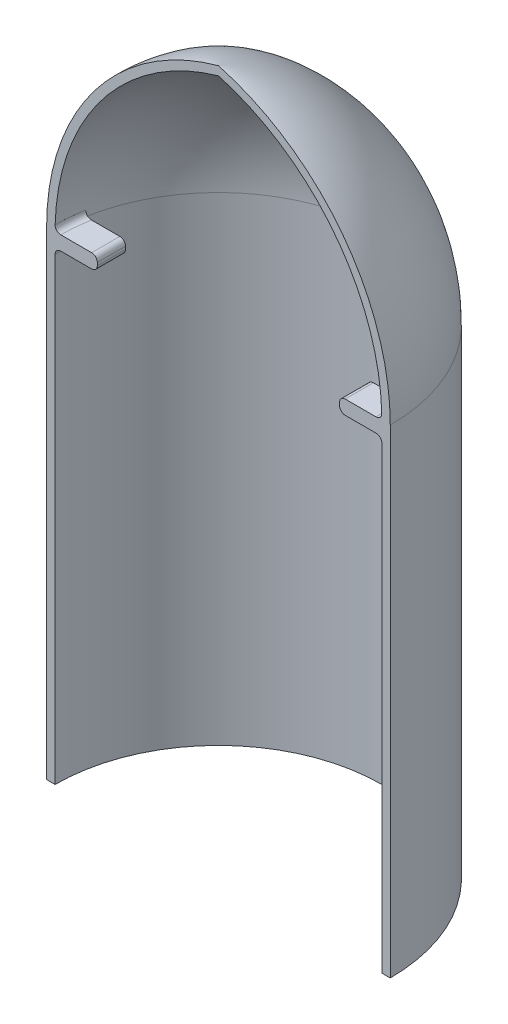
ISO-10303-21;
HEADER;
FILE_DESCRIPTION(('STEP AP214'),'2;1');
FILE_NAME('part.step','',(''),(''),'','','');
FILE_SCHEMA(('AUTOMOTIVE_DESIGN { 1 0 10303 214 1 1 1 1 }'));
ENDSEC;
DATA;
#1=APPLICATION_CONTEXT('core data for automotive mechanical design processes');
#2=APPLICATION_PROTOCOL_DEFINITION('international standard','automotive_design',2000,#1);
#3=PRODUCT_CONTEXT('',#1,'mechanical');
#4=PRODUCT('Part','Part','',(#3));
#5=PRODUCT_RELATED_PRODUCT_CATEGORY('part','',(#4));
#6=PRODUCT_DEFINITION_FORMATION('','',#4);
#7=PRODUCT_DEFINITION_CONTEXT('part definition',#1,'design');
#8=PRODUCT_DEFINITION('design','',#6,#7);
#9=PRODUCT_DEFINITION_SHAPE('','',#8);
#10=(LENGTH_UNIT() NAMED_UNIT(*) SI_UNIT(.MILLI.,.METRE.));
#11=(NAMED_UNIT(*) PLANE_ANGLE_UNIT() SI_UNIT($,.RADIAN.));
#12=(NAMED_UNIT(*) SI_UNIT($,.STERADIAN.) SOLID_ANGLE_UNIT());
#13=UNCERTAINTY_MEASURE_WITH_UNIT(LENGTH_MEASURE(1.E-05),#10,'distance_accuracy_value','');
#14=(GEOMETRIC_REPRESENTATION_CONTEXT(3) GLOBAL_UNCERTAINTY_ASSIGNED_CONTEXT((#13)) GLOBAL_UNIT_ASSIGNED_CONTEXT((#10,
#11,#12)) REPRESENTATION_CONTEXT('',''));
#15=CARTESIAN_POINT('',(0.,0.,0.));
#16=DIRECTION('',(0.,0.,1.));
#17=DIRECTION('',(1.,0.,0.));
#18=AXIS2_PLACEMENT_3D('',#15,#16,#17);
#19=CARTESIAN_POINT('',(0.,170.,21.9590163934426));
#20=DIRECTION('',(-1.,0.,0.));
#21=DIRECTION('',(0.,0.,-1.));
#22=AXIS2_PLACEMENT_3D('',#19,#20,#21);
#23=CIRCLE('',#22,82.9590163934426);
#24=TRIMMED_CURVE('',#23,(PARAMETER_VALUE(-1.30290645490157)),
(PARAMETER_VALUE(1.30290645490157)),.T.,.PARAMETER.);
#25=CARTESIAN_POINT('',(0.,170.,0.));
#26=DIRECTION('',(0.,-1.,0.));
#27=AXIS1_PLACEMENT('',#25,#26);
#28=SURFACE_OF_REVOLUTION('',#24,#27);
#29=CARTESIAN_POINT('',(-21.9590163934426,170.,0.));
#30=DIRECTION('',(0.,0.,1.));
#31=DIRECTION('',(1.,0.,0.));
#32=AXIS2_PLACEMENT_3D('',#29,#30,#31);
#33=CIRCLE('',#32,82.9590163934426);
#34=CARTESIAN_POINT('',(61.,170.,0.));
#35=VERTEX_POINT('',#34);
#36=CARTESIAN_POINT('',(0.,250.,0.));
#37=VERTEX_POINT('',#36);
#38=EDGE_CURVE('E484',#35,#37,#33,.T.);
#39=ORIENTED_EDGE('',*,*,#38,.F.);
#40=CARTESIAN_POINT('',(0.,170.,0.));
#41=DIRECTION('',(0.,-1.,0.));
#42=DIRECTION('',(0.,0.,-1.));
#43=AXIS2_PLACEMENT_3D('',#40,#41,#42);
#44=CIRCLE('',#43,61.);
#45=CARTESIAN_POINT('',(-61.,170.,4.25960723338862E-13));
#46=VERTEX_POINT('',#45);
#47=EDGE_CURVE('E216',#46,#35,#44,.T.);
#48=ORIENTED_EDGE('',*,*,#47,.F.);
#49=CARTESIAN_POINT('',(21.9590163934426,170.,-1.53338991914111E-13));
#50=DIRECTION('',(0.,0.,-1.));
#51=DIRECTION('',(-1.,0.,0.));
#52=AXIS2_PLACEMENT_3D('',#49,#50,#51);
#53=CIRCLE('',#52,82.9590163934426);
#54=EDGE_CURVE('E201',#46,#37,#53,.T.);
#55=ORIENTED_EDGE('',*,*,#54,.T.);
#56=EDGE_LOOP('',(#39,#48,#55));
#57=FACE_BOUND('',#56,.T.);
#58=ADVANCED_FACE('F33',(#57),#28,.T.);
#59=CARTESIAN_POINT('',(0.,170.,21.9590163934426));
#60=DIRECTION('',(-1.,0.,0.));
#61=DIRECTION('',(0.,0.,-1.));
#62=AXIS2_PLACEMENT_3D('',#59,#60,#61);
#63=CIRCLE('',#62,79.9590163934426);
#64=TRIMMED_CURVE('',#63,(PARAMETER_VALUE(-1.29259310940795)),
(PARAMETER_VALUE(1.29259310940795)),.T.,.PARAMETER.);
#65=CARTESIAN_POINT('',(0.,170.,0.));
#66=DIRECTION('',(0.,-1.,0.));
#67=AXIS1_PLACEMENT('',#65,#66);
#68=SURFACE_OF_REVOLUTION('',#64,#67);
#69=CARTESIAN_POINT('',(21.9590163934426,170.,-1.53338991914111E-13));
#70=DIRECTION('',(0.,0.,1.));
#71=DIRECTION('',(-1.,0.,0.));
#72=AXIS2_PLACEMENT_3D('',#69,#70,#71);
#73=CIRCLE('',#72,79.9590163934426);
#74=CARTESIAN_POINT('',(0.,246.884627212723,0.));
#75=VERTEX_POINT('',#74);
#76=CARTESIAN_POINT('',(-57.9736830101793,172.051309010619,4.04828064748096E-13));
#77=VERTEX_POINT('',#76);
#78=EDGE_CURVE('E207',#75,#77,#73,.T.);
#79=ORIENTED_EDGE('',*,*,#78,.T.);
#80=CARTESIAN_POINT('',(0.,172.051309010619,0.));
#81=DIRECTION('',(0.,-1.,0.));
#82=DIRECTION('',(0.,0.,-1.));
#83=AXIS2_PLACEMENT_3D('',#80,#81,#82);
#84=CIRCLE('',#83,57.9736830101793);
#85=CARTESIAN_POINT('',(-57.1047101539335,172.051309010619,-10.));
#86=VERTEX_POINT('',#85);
#87=EDGE_CURVE('E554',#77,#86,#84,.T.);
#88=ORIENTED_EDGE('',*,*,#87,.T.);
#89=CARTESIAN_POINT('',(-57.1047101539335,172.051309010619,-10.));
#90=CARTESIAN_POINT('',(-57.1136157296202,171.709482169664,-10.));
#91=CARTESIAN_POINT('',(-57.1202949569977,171.367626331634,-10.));
#92=CARTESIAN_POINT('',(-57.1292007151342,170.683856661428,-10.));
#93=CARTESIAN_POINT('',(-57.1314272458931,170.341942829251,-10.));
#94=CARTESIAN_POINT('',(-57.1314274283428,170.,-10.));
#95=B_SPLINE_CURVE_WITH_KNOTS('',3,(#89,#90,#91,#92,#93,#94),.UNSPECIFIED.,.F.,.F.,(4,2,4),(0.,
1.0257632449345,2.05152648986903),.UNSPECIFIED.);
#96=CARTESIAN_POINT('',(-57.1314274283428,170.,-10.));
#97=VERTEX_POINT('',#96);
#98=EDGE_CURVE('E237',#86,#97,#95,.T.);
#99=ORIENTED_EDGE('',*,*,#98,.T.);
#100=CARTESIAN_POINT('',(0.,170.,0.));
#101=DIRECTION('',(0.,-1.,0.));
#102=DIRECTION('',(0.,0.,-1.));
#103=AXIS2_PLACEMENT_3D('',#100,#101,#102);
#104=CIRCLE('',#103,58.);
#105=CARTESIAN_POINT('',(57.1314274283428,170.,-10.));
#106=VERTEX_POINT('',#105);
#107=EDGE_CURVE('E195',#97,#106,#104,.T.);
#108=ORIENTED_EDGE('',*,*,#107,.T.);
#109=CARTESIAN_POINT('',(57.1314274283428,170.,-10.));
#110=CARTESIAN_POINT('',(57.1314272458931,170.341942829251,-10.));
#111=CARTESIAN_POINT('',(57.1292007151342,170.683856661428,-10.));
#112=CARTESIAN_POINT('',(57.1202949569977,171.367626331634,-10.));
#113=CARTESIAN_POINT('',(57.1136157296202,171.709482169664,-10.));
#114=CARTESIAN_POINT('',(57.1047101539335,172.051309010619,-10.));
#115=B_SPLINE_CURVE_WITH_KNOTS('',3,(#109,#110,#111,#112,#113,#114),.UNSPECIFIED.,.F.,.F.,(4,2,
4),(0.,1.02576324493449,2.051526489869),.UNSPECIFIED.);
#116=CARTESIAN_POINT('',(57.1047101539335,172.051309010619,-10.));
#117=VERTEX_POINT('',#116);
#118=EDGE_CURVE('E229',#106,#117,#115,.T.);
#119=ORIENTED_EDGE('',*,*,#118,.T.);
#120=CARTESIAN_POINT('',(0.,172.051309010619,0.));
#121=DIRECTION('',(0.,-1.,0.));
#122=DIRECTION('',(0.,0.,-1.));
#123=AXIS2_PLACEMENT_3D('',#120,#121,#122);
#124=CIRCLE('',#123,57.9736830101793);
#125=CARTESIAN_POINT('',(57.9736830101793,172.051309010619,0.));
#126=VERTEX_POINT('',#125);
#127=EDGE_CURVE('E227',#117,#126,#124,.T.);
#128=ORIENTED_EDGE('',*,*,#127,.T.);
#129=CARTESIAN_POINT('',(-21.9590163934426,170.,0.));
#130=DIRECTION('',(0.,0.,-1.));
#131=DIRECTION('',(1.,0.,0.));
#132=AXIS2_PLACEMENT_3D('',#129,#130,#131);
#133=CIRCLE('',#132,79.9590163934426);
#134=EDGE_CURVE('E185',#75,#126,#133,.T.);
#135=ORIENTED_EDGE('',*,*,#134,.F.);
#136=EDGE_LOOP('',(#79,#88,#99,#108,#119,#128,#135));
#137=FACE_BOUND('',#136,.T.);
#138=ADVANCED_FACE('F243',(#137),#68,.F.);
#139=CARTESIAN_POINT('',(0.,0.,0.));
#140=DIRECTION('',(0.,-1.,0.));
#141=DIRECTION('',(0.,0.,-1.));
#142=AXIS2_PLACEMENT_3D('',#139,#140,#141);
#143=CYLINDRICAL_SURFACE('',#142,58.);
#144=DIRECTION('',(0.,-1.,0.));
#145=VECTOR('',#144,1.);
#146=CARTESIAN_POINT('',(-57.1314274283428,0.,-10.));
#147=LINE('',#146,#145);
#148=CARTESIAN_POINT('',(-57.1314274283428,163.,-10.));
#149=VERTEX_POINT('',#148);
#150=EDGE_CURVE('E224',#149,#97,#147,.F.);
#151=ORIENTED_EDGE('',*,*,#150,.F.);
#152=CARTESIAN_POINT('',(0.,163.,0.));
#153=DIRECTION('',(0.,-1.,0.));
#154=DIRECTION('',(0.,0.,-1.));
#155=AXIS2_PLACEMENT_3D('',#152,#153,#154);
#156=CIRCLE('',#155,58.);
#157=CARTESIAN_POINT('',(-58.,163.,4.05011835305803E-13));
#158=VERTEX_POINT('',#157);
#159=EDGE_CURVE('E299',#149,#158,#156,.F.);
#160=ORIENTED_EDGE('',*,*,#159,.T.);
#161=DIRECTION('',(0.,-1.,0.));
#162=VECTOR('',#161,1.);
#163=CARTESIAN_POINT('',(-58.,170.,4.05011835305803E-13));
#164=LINE('',#163,#162);
#165=CARTESIAN_POINT('',(-58.,0.,4.05011835305803E-13));
#166=VERTEX_POINT('',#165);
#167=EDGE_CURVE('E191',#158,#166,#164,.T.);
#168=ORIENTED_EDGE('',*,*,#167,.T.);
#169=CARTESIAN_POINT('',(0.,0.,0.));
#170=DIRECTION('',(0.,-1.,0.));
#171=DIRECTION('',(0.,0.,-1.));
#172=AXIS2_PLACEMENT_3D('',#169,#170,#171);
#173=CIRCLE('',#172,58.);
#174=CARTESIAN_POINT('',(58.,0.,0.));
#175=VERTEX_POINT('',#174);
#176=EDGE_CURVE('E188',#166,#175,#173,.T.);
#177=ORIENTED_EDGE('',*,*,#176,.T.);
#178=DIRECTION('',(0.,-1.,0.));
#179=VECTOR('',#178,1.);
#180=CARTESIAN_POINT('',(58.,170.,0.));
#181=LINE('',#180,#179);
#182=CARTESIAN_POINT('',(58.,163.,0.));
#183=VERTEX_POINT('',#182);
#184=EDGE_CURVE('E173',#183,#175,#181,.T.);
#185=ORIENTED_EDGE('',*,*,#184,.F.);
#186=CARTESIAN_POINT('',(0.,163.,0.));
#187=DIRECTION('',(0.,-1.,0.));
#188=DIRECTION('',(0.,0.,-1.));
#189=AXIS2_PLACEMENT_3D('',#186,#187,#188);
#190=CIRCLE('',#189,58.);
#191=CARTESIAN_POINT('',(57.1314274283428,163.,-10.));
#192=VERTEX_POINT('',#191);
#193=EDGE_CURVE('E508',#183,#192,#190,.F.);
#194=ORIENTED_EDGE('',*,*,#193,.T.);
#195=DIRECTION('',(0.,-1.,0.));
#196=VECTOR('',#195,1.);
#197=CARTESIAN_POINT('',(57.1314274283428,0.,-10.));
#198=LINE('',#197,#196);
#199=EDGE_CURVE('E221',#192,#106,#198,.F.);
#200=ORIENTED_EDGE('',*,*,#199,.T.);
#201=ORIENTED_EDGE('',*,*,#107,.F.);
#202=EDGE_LOOP('',(#151,#160,#168,#177,#185,#194,#200,#201));
#203=FACE_BOUND('',#202,.T.);
#204=ADVANCED_FACE('F189',(#203),#143,.F.);
#205=CARTESIAN_POINT('',(-58.,0.,4.05011835305803E-13));
#206=DIRECTION('',(0.,-1.,0.));
#207=DIRECTION('',(0.,0.,-1.));
#208=AXIS2_PLACEMENT_3D('',#205,#206,#207);
#209=PLANE('',#208);
#210=CARTESIAN_POINT('',(0.,0.,0.));
#211=DIRECTION('',(0.,-1.,0.));
#212=DIRECTION('',(0.,0.,-1.));
#213=AXIS2_PLACEMENT_3D('',#210,#211,#212);
#214=CIRCLE('',#213,61.);
#215=CARTESIAN_POINT('',(-61.,0.,4.25960723338862E-13));
#216=VERTEX_POINT('',#215);
#217=CARTESIAN_POINT('',(61.,0.,0.));
#218=VERTEX_POINT('',#217);
#219=EDGE_CURVE('E196',#216,#218,#214,.T.);
#220=ORIENTED_EDGE('',*,*,#219,.T.);
#221=DIRECTION('',(1.,0.,0.));
#222=VECTOR('',#221,1.);
#223=CARTESIAN_POINT('',(58.,0.,0.));
#224=LINE('',#223,#222);
#225=EDGE_CURVE('E178',#175,#218,#224,.T.);
#226=ORIENTED_EDGE('',*,*,#225,.F.);
#227=ORIENTED_EDGE('',*,*,#176,.F.);
#228=DIRECTION('',(-1.,0.,0.));
#229=VECTOR('',#228,1.);
#230=CARTESIAN_POINT('',(-58.,0.,4.05011835305803E-13));
#231=LINE('',#230,#229);
#232=EDGE_CURVE('E211',#166,#216,#231,.T.);
#233=ORIENTED_EDGE('',*,*,#232,.T.);
#234=EDGE_LOOP('',(#220,#226,#227,#233));
#235=FACE_BOUND('',#234,.T.);
#236=ADVANCED_FACE('F198',(#235),#209,.T.);
#237=CARTESIAN_POINT('',(0.,0.,0.));
#238=DIRECTION('',(0.,-1.,0.));
#239=DIRECTION('',(0.,0.,-1.));
#240=AXIS2_PLACEMENT_3D('',#237,#238,#239);
#241=CYLINDRICAL_SURFACE('',#240,61.);
#242=DIRECTION('',(0.,1.,0.));
#243=VECTOR('',#242,1.);
#244=CARTESIAN_POINT('',(-61.,170.,4.25960723338862E-13));
#245=LINE('',#244,#243);
#246=EDGE_CURVE('E213',#216,#46,#245,.T.);
#247=ORIENTED_EDGE('',*,*,#246,.T.);
#248=ORIENTED_EDGE('',*,*,#47,.T.);
#249=DIRECTION('',(0.,1.,0.));
#250=VECTOR('',#249,1.);
#251=CARTESIAN_POINT('',(61.,170.,0.));
#252=LINE('',#251,#250);
#253=EDGE_CURVE('E199',#218,#35,#252,.T.);
#254=ORIENTED_EDGE('',*,*,#253,.F.);
#255=ORIENTED_EDGE('',*,*,#219,.F.);
#256=EDGE_LOOP('',(#247,#248,#254,#255));
#257=FACE_BOUND('',#256,.T.);
#258=ADVANCED_FACE('F348',(#257),#241,.T.);
#259=CARTESIAN_POINT('',(21.9590163934426,170.,-1.53338991914111E-13));
#260=DIRECTION('',(0.,0.,-1.));
#261=DIRECTION('',(-1.,0.,0.));
#262=AXIS2_PLACEMENT_3D('',#259,#260,#261);
#263=PLANE('',#262);
#264=DIRECTION('',(0.,-1.,0.));
#265=VECTOR('',#264,1.);
#266=CARTESIAN_POINT('',(43.,170.,0.));
#267=LINE('',#266,#265);
#268=CARTESIAN_POINT('',(43.,168.,0.));
#269=VERTEX_POINT('',#268);
#270=CARTESIAN_POINT('',(43.,167.,0.));
#271=VERTEX_POINT('',#270);
#272=EDGE_CURVE('E494',#269,#271,#267,.T.);
#273=ORIENTED_EDGE('',*,*,#272,.T.);
#274=CARTESIAN_POINT('',(45.,167.,-3.13984949151802E-13));
#275=DIRECTION('',(0.,0.,-1.));
#276=DIRECTION('',(-1.,0.,0.));
#277=AXIS2_PLACEMENT_3D('',#274,#275,#276);
#278=CIRCLE('',#277,2.);
#279=CARTESIAN_POINT('',(45.,165.,0.));
#280=VERTEX_POINT('',#279);
#281=EDGE_CURVE('E55',#271,#280,#278,.F.);
#282=ORIENTED_EDGE('',*,*,#281,.T.);
#283=DIRECTION('',(1.,0.,0.));
#284=VECTOR('',#283,1.);
#285=CARTESIAN_POINT('',(43.,165.,0.));
#286=LINE('',#285,#284);
#287=CARTESIAN_POINT('',(56.,165.,0.));
#288=VERTEX_POINT('',#287);
#289=EDGE_CURVE('E487',#280,#288,#286,.T.);
#290=ORIENTED_EDGE('',*,*,#289,.T.);
#291=CARTESIAN_POINT('',(56.,163.,-3.91045909950431E-13));
#292=DIRECTION('',(0.,0.,-1.));
#293=DIRECTION('',(-1.,0.,0.));
#294=AXIS2_PLACEMENT_3D('',#291,#292,#293);
#295=CIRCLE('',#294,2.);
#296=EDGE_CURVE('E181',#288,#183,#295,.T.);
#297=ORIENTED_EDGE('',*,*,#296,.T.);
#298=ORIENTED_EDGE('',*,*,#184,.T.);
#299=ORIENTED_EDGE('',*,*,#225,.T.);
#300=ORIENTED_EDGE('',*,*,#253,.T.);
#301=ORIENTED_EDGE('',*,*,#38,.T.);
#302=ORIENTED_EDGE('',*,*,#54,.F.);
#303=ORIENTED_EDGE('',*,*,#246,.F.);
#304=ORIENTED_EDGE('',*,*,#232,.F.);
#305=ORIENTED_EDGE('',*,*,#167,.F.);
#306=CARTESIAN_POINT('',(-56.,163.,3.91045909950431E-13));
#307=DIRECTION('',(0.,0.,-1.));
#308=DIRECTION('',(-1.,0.,0.));
#309=AXIS2_PLACEMENT_3D('',#306,#307,#308);
#310=CIRCLE('',#309,2.);
#311=CARTESIAN_POINT('',(-56.,165.,0.));
#312=VERTEX_POINT('',#311);
#313=EDGE_CURVE('E307',#158,#312,#310,.T.);
#314=ORIENTED_EDGE('',*,*,#313,.T.);
#315=DIRECTION('',(1.,0.,0.));
#316=VECTOR('',#315,1.);
#317=CARTESIAN_POINT('',(-43.,165.,0.));
#318=LINE('',#317,#316);
#319=CARTESIAN_POINT('',(-45.,165.,0.));
#320=VERTEX_POINT('',#319);
#321=EDGE_CURVE('E526',#312,#320,#318,.T.);
#322=ORIENTED_EDGE('',*,*,#321,.T.);
#323=CARTESIAN_POINT('',(-45.,167.,3.15719672627779E-13));
#324=DIRECTION('',(0.,0.,-1.));
#325=DIRECTION('',(-1.,0.,0.));
#326=AXIS2_PLACEMENT_3D('',#323,#324,#325);
#327=CIRCLE('',#326,2.);
#328=CARTESIAN_POINT('',(-43.,167.,0.));
#329=VERTEX_POINT('',#328);
#330=EDGE_CURVE('E572',#320,#329,#327,.F.);
#331=ORIENTED_EDGE('',*,*,#330,.T.);
#332=DIRECTION('',(0.,1.,0.));
#333=VECTOR('',#332,1.);
#334=CARTESIAN_POINT('',(-43.,170.,0.));
#335=LINE('',#334,#333);
#336=CARTESIAN_POINT('',(-43.,168.,0.));
#337=VERTEX_POINT('',#336);
#338=EDGE_CURVE('E530',#329,#337,#335,.T.);
#339=ORIENTED_EDGE('',*,*,#338,.T.);
#340=CARTESIAN_POINT('',(-45.,168.,3.15719672627779E-13));
#341=DIRECTION('',(0.,0.,-1.));
#342=DIRECTION('',(-1.,0.,0.));
#343=AXIS2_PLACEMENT_3D('',#340,#341,#342);
#344=CIRCLE('',#343,2.);
#345=CARTESIAN_POINT('',(-45.,170.,0.));
#346=VERTEX_POINT('',#345);
#347=EDGE_CURVE('E558',#337,#346,#344,.F.);
#348=ORIENTED_EDGE('',*,*,#347,.T.);
#349=DIRECTION('',(-1.,0.,0.));
#350=VECTOR('',#349,1.);
#351=CARTESIAN_POINT('',(-58.,170.,0.));
#352=LINE('',#351,#350);
#353=CARTESIAN_POINT('',(-55.9743412721492,170.,0.));
#354=VERTEX_POINT('',#353);
#355=EDGE_CURVE('E532',#346,#354,#352,.T.);
#356=ORIENTED_EDGE('',*,*,#355,.T.);
#357=CARTESIAN_POINT('',(-55.9743412721492,172.,3.90866736011492E-13));
#358=DIRECTION('',(0.,0.,-1.));
#359=DIRECTION('',(-1.,0.,0.));
#360=AXIS2_PLACEMENT_3D('',#357,#358,#359);
#361=CIRCLE('',#360,2.);
#362=EDGE_CURVE('E270',#354,#77,#361,.T.);
#363=ORIENTED_EDGE('',*,*,#362,.T.);
#364=ORIENTED_EDGE('',*,*,#78,.F.);
#365=ORIENTED_EDGE('',*,*,#134,.T.);
#366=CARTESIAN_POINT('',(55.9743412721492,172.,-3.90866736011492E-13));
#367=DIRECTION('',(0.,0.,-1.));
#368=DIRECTION('',(-1.,0.,0.));
#369=AXIS2_PLACEMENT_3D('',#366,#367,#368);
#370=CIRCLE('',#369,2.);
#371=CARTESIAN_POINT('',(55.9743412721492,170.,0.));
#372=VERTEX_POINT('',#371);
#373=EDGE_CURVE('E269',#126,#372,#370,.T.);
#374=ORIENTED_EDGE('',*,*,#373,.T.);
#375=DIRECTION('',(-1.,0.,0.));
#376=VECTOR('',#375,1.);
#377=CARTESIAN_POINT('',(58.,170.,0.));
#378=LINE('',#377,#376);
#379=CARTESIAN_POINT('',(45.,170.,0.));
#380=VERTEX_POINT('',#379);
#381=EDGE_CURVE('E491',#372,#380,#378,.T.);
#382=ORIENTED_EDGE('',*,*,#381,.T.);
#383=CARTESIAN_POINT('',(45.,168.,-3.13984949151802E-13));
#384=DIRECTION('',(0.,0.,-1.));
#385=DIRECTION('',(-1.,0.,0.));
#386=AXIS2_PLACEMENT_3D('',#383,#384,#385);
#387=CIRCLE('',#386,2.);
#388=EDGE_CURVE('E552',#380,#269,#387,.F.);
#389=ORIENTED_EDGE('',*,*,#388,.T.);
#390=EDGE_LOOP('',(#273,#282,#290,#297,#298,#299,#300,#301,#302,#303,#304,#305,#314,#322,#331,
#339,#348,#356,#363,#364,#365,#374,#382,#389));
#391=FACE_BOUND('',#390,.T.);
#392=ADVANCED_FACE('F175',(#391),#263,.F.);
#393=CARTESIAN_POINT('',(43.,165.,-10.));
#394=DIRECTION('',(0.,-1.,0.));
#395=DIRECTION('',(0.,0.,-1.));
#396=AXIS2_PLACEMENT_3D('',#393,#394,#395);
#397=PLANE('',#396);
#398=ORIENTED_EDGE('',*,*,#289,.F.);
#399=DIRECTION('',(0.,0.,1.));
#400=VECTOR('',#399,1.);
#401=CARTESIAN_POINT('',(45.,165.,-10.));
#402=LINE('',#401,#400);
#403=CARTESIAN_POINT('',(45.,165.,-10.));
#404=VERTEX_POINT('',#403);
#405=EDGE_CURVE('E41',#280,#404,#402,.F.);
#406=ORIENTED_EDGE('',*,*,#405,.T.);
#407=DIRECTION('',(1.,0.,0.));
#408=VECTOR('',#407,1.);
#409=CARTESIAN_POINT('',(43.,165.,-10.));
#410=LINE('',#409,#408);
#411=CARTESIAN_POINT('',(55.0999092558236,165.,-10.));
#412=VERTEX_POINT('',#411);
#413=EDGE_CURVE('E478',#404,#412,#410,.T.);
#414=ORIENTED_EDGE('',*,*,#413,.T.);
#415=CARTESIAN_POINT('',(0.,165.,0.));
#416=DIRECTION('',(0.,-1.,0.));
#417=DIRECTION('',(0.,0.,-1.));
#418=AXIS2_PLACEMENT_3D('',#415,#416,#417);
#419=CIRCLE('',#418,56.);
#420=EDGE_CURVE('E506',#412,#288,#419,.T.);
#421=ORIENTED_EDGE('',*,*,#420,.T.);
#422=EDGE_LOOP('',(#398,#406,#414,#421));
#423=FACE_BOUND('',#422,.T.);
#424=ADVANCED_FACE('F256',(#423),#397,.T.);
#425=CARTESIAN_POINT('',(43.,170.,-10.));
#426=DIRECTION('',(-1.,0.,0.));
#427=DIRECTION('',(0.,0.,1.));
#428=AXIS2_PLACEMENT_3D('',#425,#426,#427);
#429=PLANE('',#428);
#430=DIRECTION('',(0.,-1.,0.));
#431=VECTOR('',#430,1.);
#432=CARTESIAN_POINT('',(43.,170.,-10.));
#433=LINE('',#432,#431);
#434=CARTESIAN_POINT('',(43.,168.,-10.));
#435=VERTEX_POINT('',#434);
#436=CARTESIAN_POINT('',(43.,167.,-10.));
#437=VERTEX_POINT('',#436);
#438=EDGE_CURVE('E476',#435,#437,#433,.T.);
#439=ORIENTED_EDGE('',*,*,#438,.T.);
#440=DIRECTION('',(0.,0.,1.));
#441=VECTOR('',#440,1.);
#442=CARTESIAN_POINT('',(43.,167.,-10.));
#443=LINE('',#442,#441);
#444=EDGE_CURVE('E473',#437,#271,#443,.T.);
#445=ORIENTED_EDGE('',*,*,#444,.T.);
#446=ORIENTED_EDGE('',*,*,#272,.F.);
#447=DIRECTION('',(0.,0.,1.));
#448=VECTOR('',#447,1.);
#449=CARTESIAN_POINT('',(43.,168.,-10.));
#450=LINE('',#449,#448);
#451=EDGE_CURVE('E481',#269,#435,#450,.F.);
#452=ORIENTED_EDGE('',*,*,#451,.T.);
#453=EDGE_LOOP('',(#439,#445,#446,#452));
#454=FACE_BOUND('',#453,.T.);
#455=ADVANCED_FACE('F380',(#454),#429,.T.);
#456=CARTESIAN_POINT('',(58.,170.,-10.));
#457=DIRECTION('',(0.,1.,0.));
#458=DIRECTION('',(0.,0.,1.));
#459=AXIS2_PLACEMENT_3D('',#456,#457,#458);
#460=PLANE('',#459);
#461=DIRECTION('',(-1.,0.,0.));
#462=VECTOR('',#461,1.);
#463=CARTESIAN_POINT('',(58.,170.,-10.));
#464=LINE('',#463,#462);
#465=CARTESIAN_POINT('',(55.0738311800716,170.,-10.));
#466=VERTEX_POINT('',#465);
#467=CARTESIAN_POINT('',(45.,170.,-10.));
#468=VERTEX_POINT('',#467);
#469=EDGE_CURVE('E482',#466,#468,#464,.T.);
#470=ORIENTED_EDGE('',*,*,#469,.T.);
#471=DIRECTION('',(0.,0.,1.));
#472=VECTOR('',#471,1.);
#473=CARTESIAN_POINT('',(45.,170.,-10.));
#474=LINE('',#473,#472);
#475=EDGE_CURVE('E563',#468,#380,#474,.T.);
#476=ORIENTED_EDGE('',*,*,#475,.T.);
#477=ORIENTED_EDGE('',*,*,#381,.F.);
#478=CARTESIAN_POINT('',(0.,170.,0.));
#479=DIRECTION('',(0.,1.,0.));
#480=DIRECTION('',(0.,0.,1.));
#481=AXIS2_PLACEMENT_3D('',#478,#479,#480);
#482=CIRCLE('',#481,55.9743412721492);
#483=EDGE_CURVE('E505',#372,#466,#482,.T.);
#484=ORIENTED_EDGE('',*,*,#483,.T.);
#485=EDGE_LOOP('',(#470,#476,#477,#484));
#486=FACE_BOUND('',#485,.T.);
#487=ADVANCED_FACE('F253',(#486),#460,.T.);
#488=CARTESIAN_POINT('',(0.,0.,-10.));
#489=DIRECTION('',(0.,0.,1.));
#490=DIRECTION('',(1.,0.,0.));
#491=AXIS2_PLACEMENT_3D('',#488,#489,#490);
#492=PLANE('',#491);
#493=ORIENTED_EDGE('',*,*,#413,.F.);
#494=CARTESIAN_POINT('',(45.,167.,-10.));
#495=DIRECTION('',(0.,0.,1.));
#496=DIRECTION('',(1.,0.,0.));
#497=AXIS2_PLACEMENT_3D('',#494,#495,#496);
#498=CIRCLE('',#497,2.);
#499=EDGE_CURVE('E11',#404,#437,#498,.F.);
#500=ORIENTED_EDGE('',*,*,#499,.T.);
#501=ORIENTED_EDGE('',*,*,#438,.F.);
#502=CARTESIAN_POINT('',(45.,168.,-10.));
#503=DIRECTION('',(0.,0.,1.));
#504=DIRECTION('',(1.,0.,0.));
#505=AXIS2_PLACEMENT_3D('',#502,#503,#504);
#506=CIRCLE('',#505,2.);
#507=EDGE_CURVE('E324',#435,#468,#506,.F.);
#508=ORIENTED_EDGE('',*,*,#507,.T.);
#509=ORIENTED_EDGE('',*,*,#469,.F.);
#510=CARTESIAN_POINT('',(55.0738311800716,170.,-10.));
#511=CARTESIAN_POINT('',(55.1316669174278,170.000000878762,-10.));
#512=CARTESIAN_POINT('',(55.1894752812994,170.002430147417,-10.));
#513=CARTESIAN_POINT('',(55.3046840903158,170.012126320581,-10.));
#514=CARTESIAN_POINT('',(55.3620845398591,170.019393172846,-10.));
#515=CARTESIAN_POINT('',(55.5330114850968,170.048398616933,-10.));
#516=CARTESIAN_POINT('',(55.6454018285011,170.07734220186,-10.));
#517=CARTESIAN_POINT('',(55.8637368159473,170.153726299777,-10.));
#518=CARTESIAN_POINT('',(55.9696771436585,170.201179045114,-10.));
#519=CARTESIAN_POINT('',(56.1719874600899,170.313326375222,-10.));
#520=CARTESIAN_POINT('',(56.2683603430528,170.378015723807,-10.));
#521=CARTESIAN_POINT('',(56.4479529471598,170.522311643355,-10.));
#522=CARTESIAN_POINT('',(56.5312702768799,170.601796723893,-10.));
#523=CARTESIAN_POINT('',(56.6831461450383,170.773833244896,-10.));
#524=CARTESIAN_POINT('',(56.7517030410621,170.866386137539,-10.));
#525=CARTESIAN_POINT('',(56.8710040740183,171.060435462612,-10.));
#526=CARTESIAN_POINT('',(56.9219971545223,171.161779012468,-10.));
#527=CARTESIAN_POINT('',(57.0059579846086,171.371650415502,-10.));
#528=CARTESIAN_POINT('',(57.0389369050919,171.480173769432,-10.));
#529=CARTESIAN_POINT('',(57.078456953239,171.666304747324,-10.));
#530=CARTESIAN_POINT('',(57.0900544861534,171.742877072216,-10.));
#531=CARTESIAN_POINT('',(57.1041894622641,171.896764204758,-10.));
#532=CARTESIAN_POINT('',(57.1067372875994,171.974078059483,-10.));
#533=CARTESIAN_POINT('',(57.1047101539335,172.051309010619,-10.));
#534=B_SPLINE_CURVE_WITH_KNOTS('',3,(#510,#511,#512,#513,#514,#515,#516,#517,#518,#519,#520,
#521,#522,#523,#524,#525,#526,#527,#528,#529,#530,#531,#532,#533),.UNSPECIFIED.,.F.,.F.,(4,2,2,
2,2,2,2,2,2,2,2,4),(0.,0.173401630870787,0.346801389102752,0.69319139074218,1.03981070378241,
1.3863248396195,1.73011005598631,2.07393350607399,2.41266114844227,2.75117850062141,
2.9830129791073,3.21458140295765),.UNSPECIFIED.);
#535=EDGE_CURVE('E262',#466,#117,#534,.T.);
#536=ORIENTED_EDGE('',*,*,#535,.T.);
#537=ORIENTED_EDGE('',*,*,#118,.F.);
#538=ORIENTED_EDGE('',*,*,#199,.F.);
#539=CARTESIAN_POINT('',(57.1314274283428,163.,-10.));
#540=CARTESIAN_POINT('',(57.1314274857169,163.055651593382,-10.));
#541=CARTESIAN_POINT('',(57.1290677730939,163.111276316446,-10.));
#542=CARTESIAN_POINT('',(57.1196568373087,163.222123128383,-10.));
#543=CARTESIAN_POINT('',(57.1126059754897,163.277345247936,-10.));
#544=CARTESIAN_POINT('',(57.0844967653398,163.441671620205,-10.));
#545=CARTESIAN_POINT('',(57.0564815239229,163.549667706423,-10.));
#546=CARTESIAN_POINT('',(56.982742721421,163.759408578697,-10.));
#547=CARTESIAN_POINT('',(56.9370131734301,163.861151237797,-10.));
#548=CARTESIAN_POINT('',(56.8292293384363,164.055587574304,-10.));
#549=CARTESIAN_POINT('',(56.7671760318079,164.148281794686,-10.));
#550=CARTESIAN_POINT('',(56.6281339614795,164.322659886142,-10.));
#551=CARTESIAN_POINT('',(56.5510521921438,164.404269528369,-10.));
#552=CARTESIAN_POINT('',(56.3844385161602,164.553625104908,-10.));
#553=CARTESIAN_POINT('',(56.2949039192486,164.621368035669,-10.));
#554=CARTESIAN_POINT('',(56.1045749706432,164.742091569965,-10.));
#555=CARTESIAN_POINT('',(56.003637092604,164.79484564166,-10.));
#556=CARTESIAN_POINT('',(55.7944368120087,164.88291270506,-10.));
#557=CARTESIAN_POINT('',(55.6861770428655,164.918231929901,-10.));
#558=CARTESIAN_POINT('',(55.4978583515553,164.962877636359,-10.));
#559=CARTESIAN_POINT('',(55.4188540284918,164.976791373502,-10.));
#560=CARTESIAN_POINT('',(55.2598788244929,164.995352145464,-10.));
#561=CARTESIAN_POINT('',(55.1799094866658,165.000012398375,-10.));
#562=CARTESIAN_POINT('',(55.0999092558236,165.,-10.));
#563=B_SPLINE_CURVE_WITH_KNOTS('',3,(#539,#540,#541,#542,#543,#544,#545,#546,#547,#548,#549,
#550,#551,#552,#553,#554,#555,#556,#557,#558,#559,#560,#561,#562),.UNSPECIFIED.,.F.,.F.,(4,2,2,
2,2,2,2,2,2,2,2,4),(0.,0.166851513574643,0.333690176632439,0.666680955957266,0.999784374535321,
1.33286779210856,1.66808201114652,2.00336876146132,2.34348177835189,2.68347311311424,
2.92362115886253,3.1634259188631),.UNSPECIFIED.);
#564=EDGE_CURVE('E288',#192,#412,#563,.T.);
#565=ORIENTED_EDGE('',*,*,#564,.T.);
#566=EDGE_LOOP('',(#493,#500,#501,#508,#509,#536,#537,#538,#565));
#567=FACE_BOUND('',#566,.T.);
#568=ADVANCED_FACE('F247',(#567),#492,.F.);
#569=CARTESIAN_POINT('',(-43.,165.,-10.));
#570=DIRECTION('',(0.,-1.,0.));
#571=DIRECTION('',(0.,0.,-1.));
#572=AXIS2_PLACEMENT_3D('',#569,#570,#571);
#573=PLANE('',#572);
#574=DIRECTION('',(1.,0.,0.));
#575=VECTOR('',#574,1.);
#576=CARTESIAN_POINT('',(-43.,165.,-10.));
#577=LINE('',#576,#575);
#578=CARTESIAN_POINT('',(-55.0999092558236,165.,-10.));
#579=VERTEX_POINT('',#578);
#580=CARTESIAN_POINT('',(-45.,165.,-10.));
#581=VERTEX_POINT('',#580);
#582=EDGE_CURVE('E519',#579,#581,#577,.T.);
#583=ORIENTED_EDGE('',*,*,#582,.T.);
#584=DIRECTION('',(0.,0.,1.));
#585=VECTOR('',#584,1.);
#586=CARTESIAN_POINT('',(-45.,165.,-10.));
#587=LINE('',#586,#585);
#588=EDGE_CURVE('E527',#581,#320,#587,.T.);
#589=ORIENTED_EDGE('',*,*,#588,.T.);
#590=ORIENTED_EDGE('',*,*,#321,.F.);
#591=CARTESIAN_POINT('',(0.,165.,0.));
#592=DIRECTION('',(0.,-1.,0.));
#593=DIRECTION('',(0.,0.,-1.));
#594=AXIS2_PLACEMENT_3D('',#591,#592,#593);
#595=CIRCLE('',#594,56.);
#596=EDGE_CURVE('E295',#312,#579,#595,.T.);
#597=ORIENTED_EDGE('',*,*,#596,.T.);
#598=EDGE_LOOP('',(#583,#589,#590,#597));
#599=FACE_BOUND('',#598,.T.);
#600=ADVANCED_FACE('F252',(#599),#573,.T.);
#601=CARTESIAN_POINT('',(-58.,170.,-10.));
#602=DIRECTION('',(0.,1.,0.));
#603=DIRECTION('',(0.,0.,1.));
#604=AXIS2_PLACEMENT_3D('',#601,#602,#603);
#605=PLANE('',#604);
#606=DIRECTION('',(-1.,0.,0.));
#607=VECTOR('',#606,1.);
#608=CARTESIAN_POINT('',(-58.,170.,-10.));
#609=LINE('',#608,#607);
#610=CARTESIAN_POINT('',(-45.,170.,-10.));
#611=VERTEX_POINT('',#610);
#612=CARTESIAN_POINT('',(-55.0738311800716,170.,-10.));
#613=VERTEX_POINT('',#612);
#614=EDGE_CURVE('E495',#611,#613,#609,.T.);
#615=ORIENTED_EDGE('',*,*,#614,.T.);
#616=CARTESIAN_POINT('',(0.,170.,0.));
#617=DIRECTION('',(0.,1.,0.));
#618=DIRECTION('',(0.,0.,1.));
#619=AXIS2_PLACEMENT_3D('',#616,#617,#618);
#620=CIRCLE('',#619,55.9743412721492);
#621=EDGE_CURVE('E546',#613,#354,#620,.T.);
#622=ORIENTED_EDGE('',*,*,#621,.T.);
#623=ORIENTED_EDGE('',*,*,#355,.F.);
#624=DIRECTION('',(0.,0.,1.));
#625=VECTOR('',#624,1.);
#626=CARTESIAN_POINT('',(-45.,170.,-10.));
#627=LINE('',#626,#625);
#628=EDGE_CURVE('E548',#346,#611,#627,.F.);
#629=ORIENTED_EDGE('',*,*,#628,.T.);
#630=EDGE_LOOP('',(#615,#622,#623,#629));
#631=FACE_BOUND('',#630,.T.);
#632=ADVANCED_FACE('F316',(#631),#605,.T.);
#633=CARTESIAN_POINT('',(-43.,170.,-10.));
#634=DIRECTION('',(1.,0.,0.));
#635=DIRECTION('',(0.,0.,-1.));
#636=AXIS2_PLACEMENT_3D('',#633,#634,#635);
#637=PLANE('',#636);
#638=ORIENTED_EDGE('',*,*,#338,.F.);
#639=DIRECTION('',(0.,0.,1.));
#640=VECTOR('',#639,1.);
#641=CARTESIAN_POINT('',(-43.,167.,-10.));
#642=LINE('',#641,#640);
#643=CARTESIAN_POINT('',(-43.,167.,-10.));
#644=VERTEX_POINT('',#643);
#645=EDGE_CURVE('E571',#329,#644,#642,.F.);
#646=ORIENTED_EDGE('',*,*,#645,.T.);
#647=DIRECTION('',(0.,1.,0.));
#648=VECTOR('',#647,1.);
#649=CARTESIAN_POINT('',(-43.,170.,-10.));
#650=LINE('',#649,#648);
#651=CARTESIAN_POINT('',(-43.,168.,-10.));
#652=VERTEX_POINT('',#651);
#653=EDGE_CURVE('E539',#644,#652,#650,.T.);
#654=ORIENTED_EDGE('',*,*,#653,.T.);
#655=DIRECTION('',(0.,0.,1.));
#656=VECTOR('',#655,1.);
#657=CARTESIAN_POINT('',(-43.,168.,-10.));
#658=LINE('',#657,#656);
#659=EDGE_CURVE('E550',#652,#337,#658,.T.);
#660=ORIENTED_EDGE('',*,*,#659,.T.);
#661=EDGE_LOOP('',(#638,#646,#654,#660));
#662=FACE_BOUND('',#661,.T.);
#663=ADVANCED_FACE('F314',(#662),#637,.T.);
#664=CARTESIAN_POINT('',(0.,0.,-10.));
#665=DIRECTION('',(0.,0.,-1.));
#666=DIRECTION('',(-1.,0.,0.));
#667=AXIS2_PLACEMENT_3D('',#664,#665,#666);
#668=PLANE('',#667);
#669=ORIENTED_EDGE('',*,*,#653,.F.);
#670=CARTESIAN_POINT('',(-45.,167.,-10.));
#671=DIRECTION('',(0.,0.,-1.));
#672=DIRECTION('',(-1.,0.,0.));
#673=AXIS2_PLACEMENT_3D('',#670,#671,#672);
#674=CIRCLE('',#673,2.);
#675=EDGE_CURVE('E573',#644,#581,#674,.T.);
#676=ORIENTED_EDGE('',*,*,#675,.T.);
#677=ORIENTED_EDGE('',*,*,#582,.F.);
#678=CARTESIAN_POINT('',(-55.0999092558236,165.,-10.));
#679=CARTESIAN_POINT('',(-55.1577431496487,164.99999912118,-10.));
#680=CARTESIAN_POINT('',(-55.2155496702025,164.997569933852,-10.));
#681=CARTESIAN_POINT('',(-55.3307548067987,164.987874089543,-10.));
#682=CARTESIAN_POINT('',(-55.3881534272443,164.980607484863,-10.));
#683=CARTESIAN_POINT('',(-55.559076354481,164.95160279606,-10.));
#684=CARTESIAN_POINT('',(-55.6714645150467,164.922659732609,-10.));
#685=CARTESIAN_POINT('',(-55.8897953742488,164.846276915126,-10.));
#686=CARTESIAN_POINT('',(-55.9957337469896,164.798824901689,-10.));
#687=CARTESIAN_POINT('',(-56.1980386674778,164.686680218879,-10.));
#688=CARTESIAN_POINT('',(-56.2944082630716,164.621993063581,-10.));
#689=CARTESIAN_POINT('',(-56.4739941037605,164.477703328488,-10.));
#690=CARTESIAN_POINT('',(-56.5573080807472,164.398222391407,-10.));
#691=CARTESIAN_POINT('',(-56.7091827057727,164.226189909558,-10.));
#692=CARTESIAN_POINT('',(-56.7777409276371,164.133636219477,-10.));
#693=CARTESIAN_POINT('',(-56.8970490944029,163.939579736803,-10.));
#694=CARTESIAN_POINT('',(-56.9480466578216,163.83822897769,-10.));
#695=CARTESIAN_POINT('',(-57.0320059871643,163.628352434008,-10.));
#696=CARTESIAN_POINT('',(-57.0649822829602,163.519832509039,-10.));
#697=CARTESIAN_POINT('',(-57.1027281325123,163.342079374396,-10.));
#698=CARTESIAN_POINT('',(-57.1134842869025,163.274060954951,-10.));
#699=CARTESIAN_POINT('',(-57.1278320422017,163.137372207828,-10.));
#700=CARTESIAN_POINT('',(-57.1314339677013,163.068702963501,-10.));
#701=CARTESIAN_POINT('',(-57.1314274283428,163.,-10.));
#702=B_SPLINE_CURVE_WITH_KNOTS('',3,(#678,#679,#680,#681,#682,#683,#684,#685,#686,#687,#688,
#689,#690,#691,#692,#693,#694,#695,#696,#697,#698,#699,#700,#701),.UNSPECIFIED.,.F.,.F.,(4,2,2,
2,2,2,2,2,2,2,2,4),(0.,0.173396102698938,0.346790330761606,0.693173606324427,1.03978669956762,
1.38628903306188,1.73005891772361,2.07388528269666,2.41264321157659,2.75112760817138,
2.9573741523013,3.16332283584241),.UNSPECIFIED.);
#703=EDGE_CURVE('E301',#579,#149,#702,.T.);
#704=ORIENTED_EDGE('',*,*,#703,.T.);
#705=ORIENTED_EDGE('',*,*,#150,.T.);
#706=ORIENTED_EDGE('',*,*,#98,.F.);
#707=CARTESIAN_POINT('',(-57.1047101539335,172.051309010619,-10.));
#708=CARTESIAN_POINT('',(-57.1061588533367,171.995706248487,-10.));
#709=CARTESIAN_POINT('',(-57.1052504636218,171.940068869025,-10.));
#710=CARTESIAN_POINT('',(-57.0987374931496,171.829073801262,-10.));
#711=CARTESIAN_POINT('',(-57.0931332574382,171.773716092712,-10.));
#712=CARTESIAN_POINT('',(-57.0693360882532,171.608798937074,-10.));
#713=CARTESIAN_POINT('',(-57.044164439581,171.500164931458,-10.));
#714=CARTESIAN_POINT('',(-56.9759611564142,171.288679870365,-10.));
#715=CARTESIAN_POINT('',(-56.9329232107044,171.185830873017,-10.));
#716=CARTESIAN_POINT('',(-56.8302926493261,170.988752431433,-10.));
#717=CARTESIAN_POINT('',(-56.7707009330359,170.894522519286,-10.));
#718=CARTESIAN_POINT('',(-56.6363270090467,170.716720311015,-10.));
#719=CARTESIAN_POINT('',(-56.5614560494069,170.63321515281,-10.));
#720=CARTESIAN_POINT('',(-56.398921465081,170.479736572094,-10.));
#721=CARTESIAN_POINT('',(-56.3112556962844,170.409765422145,-10.));
#722=CARTESIAN_POINT('',(-56.1243222553547,170.284297152036,-10.));
#723=CARTESIAN_POINT('',(-56.0249085682553,170.229017769029,-10.));
#724=CARTESIAN_POINT('',(-55.8183099578931,170.135669270335,-10.));
#725=CARTESIAN_POINT('',(-55.711126417727,170.097597100311,-10.));
#726=CARTESIAN_POINT('',(-55.5155366832475,170.045832065986,-10.));
#727=CARTESIAN_POINT('',(-55.4280318969276,170.028662258935,-10.));
#728=CARTESIAN_POINT('',(-55.2516371846318,170.005740652606,-10.));
#729=CARTESIAN_POINT('',(-55.1627488796125,169.999976376189,-10.));
#730=CARTESIAN_POINT('',(-55.0738311800716,170.,-10.));
#731=B_SPLINE_CURVE_WITH_KNOTS('',3,(#707,#708,#709,#710,#711,#712,#713,#714,#715,#716,#717,
#718,#719,#720,#721,#722,#723,#724,#725,#726,#727,#728,#729,#730),.UNSPECIFIED.,.F.,.F.,(4,2,2,
2,2,2,2,2,2,2,2,4),(0.,0.166761837935753,0.333511423459789,0.666327655828354,0.999261554692144,
1.33217736855094,1.6670850267636,2.00204887223237,2.34173046068595,2.68135173084745,
2.94815412077842,3.21466447915378),.UNSPECIFIED.);
#732=EDGE_CURVE('E319',#86,#613,#731,.T.);
#733=ORIENTED_EDGE('',*,*,#732,.T.);
#734=ORIENTED_EDGE('',*,*,#614,.F.);
#735=CARTESIAN_POINT('',(-45.,168.,-10.));
#736=DIRECTION('',(0.,0.,-1.));
#737=DIRECTION('',(-1.,0.,0.));
#738=AXIS2_PLACEMENT_3D('',#735,#736,#737);
#739=CIRCLE('',#738,2.);
#740=EDGE_CURVE('E560',#611,#652,#739,.T.);
#741=ORIENTED_EDGE('',*,*,#740,.T.);
#742=EDGE_LOOP('',(#669,#676,#677,#704,#705,#706,#733,#734,#741));
#743=FACE_BOUND('',#742,.T.);
#744=ADVANCED_FACE('F309',(#743),#668,.T.);
#745=CARTESIAN_POINT('',(0.,172.,0.));
#746=DIRECTION('',(0.,1.,0.));
#747=DIRECTION('',(0.,0.,1.));
#748=AXIS2_PLACEMENT_3D('',#745,#746,#747);
#749=TOROIDAL_SURFACE('',#748,55.9743412721492,2.);
#750=ORIENTED_EDGE('',*,*,#362,.F.);
#751=ORIENTED_EDGE('',*,*,#621,.F.);
#752=ORIENTED_EDGE('',*,*,#732,.F.);
#753=ORIENTED_EDGE('',*,*,#87,.F.);
#754=EDGE_LOOP('',(#750,#751,#752,#753));
#755=FACE_BOUND('',#754,.T.);
#756=ADVANCED_FACE('F313',(#755),#749,.F.);
#757=CARTESIAN_POINT('',(-45.,168.,-10.));
#758=DIRECTION('',(0.,0.,1.));
#759=DIRECTION('',(1.,0.,0.));
#760=AXIS2_PLACEMENT_3D('',#757,#758,#759);
#761=CYLINDRICAL_SURFACE('',#760,2.);
#762=ORIENTED_EDGE('',*,*,#740,.F.);
#763=ORIENTED_EDGE('',*,*,#628,.F.);
#764=ORIENTED_EDGE('',*,*,#347,.F.);
#765=ORIENTED_EDGE('',*,*,#659,.F.);
#766=EDGE_LOOP('',(#762,#763,#764,#765));
#767=FACE_BOUND('',#766,.T.);
#768=ADVANCED_FACE('F328',(#767),#761,.T.);
#769=CARTESIAN_POINT('',(45.,168.,-10.));
#770=DIRECTION('',(0.,0.,1.));
#771=DIRECTION('',(1.,0.,0.));
#772=AXIS2_PLACEMENT_3D('',#769,#770,#771);
#773=CYLINDRICAL_SURFACE('',#772,2.);
#774=ORIENTED_EDGE('',*,*,#507,.F.);
#775=ORIENTED_EDGE('',*,*,#451,.F.);
#776=ORIENTED_EDGE('',*,*,#388,.F.);
#777=ORIENTED_EDGE('',*,*,#475,.F.);
#778=EDGE_LOOP('',(#774,#775,#776,#777));
#779=FACE_BOUND('',#778,.T.);
#780=ADVANCED_FACE('F279',(#779),#773,.T.);
#781=CARTESIAN_POINT('',(0.,172.,0.));
#782=DIRECTION('',(0.,1.,0.));
#783=DIRECTION('',(0.,0.,1.));
#784=AXIS2_PLACEMENT_3D('',#781,#782,#783);
#785=TOROIDAL_SURFACE('',#784,55.9743412721492,2.);
#786=ORIENTED_EDGE('',*,*,#373,.F.);
#787=ORIENTED_EDGE('',*,*,#127,.F.);
#788=ORIENTED_EDGE('',*,*,#535,.F.);
#789=ORIENTED_EDGE('',*,*,#483,.F.);
#790=EDGE_LOOP('',(#786,#787,#788,#789));
#791=FACE_BOUND('',#790,.T.);
#792=ADVANCED_FACE('F273',(#791),#785,.F.);
#793=CARTESIAN_POINT('',(0.,163.,0.));
#794=DIRECTION('',(0.,-1.,0.));
#795=DIRECTION('',(0.,0.,-1.));
#796=AXIS2_PLACEMENT_3D('',#793,#794,#795);
#797=TOROIDAL_SURFACE('',#796,56.,2.);
#798=ORIENTED_EDGE('',*,*,#564,.F.);
#799=ORIENTED_EDGE('',*,*,#193,.F.);
#800=ORIENTED_EDGE('',*,*,#296,.F.);
#801=ORIENTED_EDGE('',*,*,#420,.F.);
#802=EDGE_LOOP('',(#798,#799,#800,#801));
#803=FACE_BOUND('',#802,.T.);
#804=ADVANCED_FACE('F278',(#803),#797,.F.);
#805=CARTESIAN_POINT('',(0.,163.,0.));
#806=DIRECTION('',(0.,-1.,0.));
#807=DIRECTION('',(0.,0.,-1.));
#808=AXIS2_PLACEMENT_3D('',#805,#806,#807);
#809=TOROIDAL_SURFACE('',#808,56.,2.);
#810=ORIENTED_EDGE('',*,*,#313,.F.);
#811=ORIENTED_EDGE('',*,*,#159,.F.);
#812=ORIENTED_EDGE('',*,*,#703,.F.);
#813=ORIENTED_EDGE('',*,*,#596,.F.);
#814=EDGE_LOOP('',(#810,#811,#812,#813));
#815=FACE_BOUND('',#814,.T.);
#816=ADVANCED_FACE('F285',(#815),#809,.F.);
#817=CARTESIAN_POINT('',(-45.,167.,-10.));
#818=DIRECTION('',(0.,0.,1.));
#819=DIRECTION('',(1.,0.,0.));
#820=AXIS2_PLACEMENT_3D('',#817,#818,#819);
#821=CYLINDRICAL_SURFACE('',#820,2.);
#822=ORIENTED_EDGE('',*,*,#675,.F.);
#823=ORIENTED_EDGE('',*,*,#645,.F.);
#824=ORIENTED_EDGE('',*,*,#330,.F.);
#825=ORIENTED_EDGE('',*,*,#588,.F.);
#826=EDGE_LOOP('',(#822,#823,#824,#825));
#827=FACE_BOUND('',#826,.T.);
#828=ADVANCED_FACE('F452',(#827),#821,.T.);
#829=CARTESIAN_POINT('',(45.,167.,-10.));
#830=DIRECTION('',(0.,0.,1.));
#831=DIRECTION('',(1.,0.,0.));
#832=AXIS2_PLACEMENT_3D('',#829,#830,#831);
#833=CYLINDRICAL_SURFACE('',#832,2.);
#834=ORIENTED_EDGE('',*,*,#499,.F.);
#835=ORIENTED_EDGE('',*,*,#405,.F.);
#836=ORIENTED_EDGE('',*,*,#281,.F.);
#837=ORIENTED_EDGE('',*,*,#444,.F.);
#838=EDGE_LOOP('',(#834,#835,#836,#837));
#839=FACE_BOUND('',#838,.T.);
#840=ADVANCED_FACE('F35',(#839),#833,.T.);
#841=CLOSED_SHELL('',(#58,#138,#204,#236,#258,#392,#424,#455,#487,#568,#600,#632,#663,#744,#756,
#768,#780,#792,#804,#816,#828,#840));
#842=MANIFOLD_SOLID_BREP('B2',#841);
#843=ADVANCED_BREP_SHAPE_REPRESENTATION('',(#18,#842),#14);
#844=SHAPE_DEFINITION_REPRESENTATION(#9,#843);
ENDSEC;
END-ISO-10303-21;
